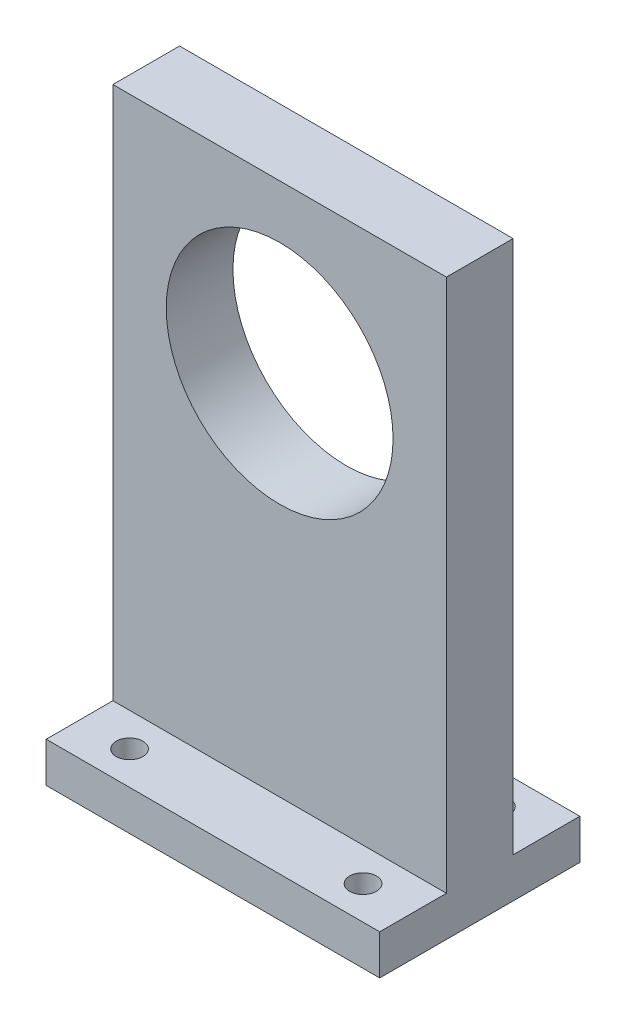
ISO-10303-21;
HEADER;
FILE_DESCRIPTION(('STEP AP214'),'2;1');
FILE_NAME('part.step','',(''),(''),'','','');
FILE_SCHEMA(('AUTOMOTIVE_DESIGN { 1 0 10303 214 1 1 1 1 }'));
ENDSEC;
DATA;
#1=APPLICATION_CONTEXT('core data for automotive mechanical design processes');
#2=APPLICATION_PROTOCOL_DEFINITION('international standard','automotive_design',2000,#1);
#3=PRODUCT_CONTEXT('',#1,'mechanical');
#4=PRODUCT('Part','Part','',(#3));
#5=PRODUCT_RELATED_PRODUCT_CATEGORY('part','',(#4));
#6=PRODUCT_DEFINITION_FORMATION('','',#4);
#7=PRODUCT_DEFINITION_CONTEXT('part definition',#1,'design');
#8=PRODUCT_DEFINITION('design','',#6,#7);
#9=PRODUCT_DEFINITION_SHAPE('','',#8);
#10=(LENGTH_UNIT() NAMED_UNIT(*) SI_UNIT(.MILLI.,.METRE.));
#11=(NAMED_UNIT(*) PLANE_ANGLE_UNIT() SI_UNIT($,.RADIAN.));
#12=(NAMED_UNIT(*) SI_UNIT($,.STERADIAN.) SOLID_ANGLE_UNIT());
#13=UNCERTAINTY_MEASURE_WITH_UNIT(LENGTH_MEASURE(1.E-05),#10,'distance_accuracy_value','');
#14=(GEOMETRIC_REPRESENTATION_CONTEXT(3) GLOBAL_UNCERTAINTY_ASSIGNED_CONTEXT((#13)) GLOBAL_UNIT_ASSIGNED_CONTEXT((#10,
#11,#12)) REPRESENTATION_CONTEXT('',''));
#15=CARTESIAN_POINT('',(0.,0.,0.));
#16=DIRECTION('',(0.,0.,1.));
#17=DIRECTION('',(1.,0.,0.));
#18=AXIS2_PLACEMENT_3D('',#15,#16,#17);
#19=CARTESIAN_POINT('',(0.,3.,0.));
#20=DIRECTION('',(0.,-1.,0.));
#21=DIRECTION('',(0.,0.,-1.));
#22=AXIS2_PLACEMENT_3D('',#19,#20,#21);
#23=PLANE('',#22);
#24=CARTESIAN_POINT('',(-8.75000000000001,3.,5.));
#25=DIRECTION('',(0.,-1.,0.));
#26=DIRECTION('',(0.,0.,-1.));
#27=AXIS2_PLACEMENT_3D('',#24,#25,#26);
#28=CIRCLE('',#27,1.);
#29=CARTESIAN_POINT('',(-8.75000000000001,3.,4.));
#30=VERTEX_POINT('',#29);
#31=EDGE_CURVE('E198',#30,#30,#28,.T.);
#32=ORIENTED_EDGE('',*,*,#31,.T.);
#33=EDGE_LOOP('',(#32));
#34=FACE_BOUND('',#33,.T.);
#35=CARTESIAN_POINT('',(8.75,3.,5.));
#36=DIRECTION('',(0.,-1.,0.));
#37=DIRECTION('',(0.,0.,-1.));
#38=AXIS2_PLACEMENT_3D('',#35,#36,#37);
#39=CIRCLE('',#38,1.);
#40=CARTESIAN_POINT('',(8.75,3.,4.));
#41=VERTEX_POINT('',#40);
#42=EDGE_CURVE('E191',#41,#41,#39,.T.);
#43=ORIENTED_EDGE('',*,*,#42,.T.);
#44=EDGE_LOOP('',(#43));
#45=FACE_BOUND('',#44,.T.);
#46=DIRECTION('',(1.,0.,0.));
#47=VECTOR('',#46,1.);
#48=CARTESIAN_POINT('',(-12.5,3.,2.5));
#49=LINE('',#48,#47);
#50=CARTESIAN_POINT('',(-12.5,3.,2.5));
#51=VERTEX_POINT('',#50);
#52=CARTESIAN_POINT('',(12.5,3.,2.5));
#53=VERTEX_POINT('',#52);
#54=EDGE_CURVE('E49',#51,#53,#49,.T.);
#55=ORIENTED_EDGE('',*,*,#54,.F.);
#56=DIRECTION('',(0.,0.,1.));
#57=VECTOR('',#56,1.);
#58=CARTESIAN_POINT('',(-12.5,3.,7.5));
#59=LINE('',#58,#57);
#60=CARTESIAN_POINT('',(-12.5,3.,7.5));
#61=VERTEX_POINT('',#60);
#62=EDGE_CURVE('E134',#51,#61,#59,.T.);
#63=ORIENTED_EDGE('',*,*,#62,.T.);
#64=DIRECTION('',(1.,0.,0.));
#65=VECTOR('',#64,1.);
#66=CARTESIAN_POINT('',(-12.5,3.,7.5));
#67=LINE('',#66,#65);
#68=CARTESIAN_POINT('',(12.5,3.,7.5));
#69=VERTEX_POINT('',#68);
#70=EDGE_CURVE('E137',#61,#69,#67,.T.);
#71=ORIENTED_EDGE('',*,*,#70,.T.);
#72=DIRECTION('',(0.,0.,-1.));
#73=VECTOR('',#72,1.);
#74=CARTESIAN_POINT('',(12.5,3.,7.5));
#75=LINE('',#74,#73);
#76=EDGE_CURVE('E130',#69,#53,#75,.T.);
#77=ORIENTED_EDGE('',*,*,#76,.T.);
#78=EDGE_LOOP('',(#55,#63,#71,#77));
#79=FACE_BOUND('',#78,.T.);
#80=ADVANCED_FACE('F34',(#34,#45,#79),#23,.F.);
#81=CARTESIAN_POINT('',(-8.75000000000001,3.,-5.));
#82=DIRECTION('',(0.,1.,0.));
#83=DIRECTION('',(0.,0.,1.));
#84=AXIS2_PLACEMENT_3D('',#81,#82,#83);
#85=CIRCLE('',#84,1.);
#86=CARTESIAN_POINT('',(-8.75000000000001,3.,-4.));
#87=VERTEX_POINT('',#86);
#88=EDGE_CURVE('E186',#87,#87,#85,.T.);
#89=ORIENTED_EDGE('',*,*,#88,.F.);
#90=EDGE_LOOP('',(#89));
#91=FACE_BOUND('',#90,.T.);
#92=CARTESIAN_POINT('',(8.75,3.,-5.));
#93=DIRECTION('',(0.,1.,0.));
#94=DIRECTION('',(0.,0.,1.));
#95=AXIS2_PLACEMENT_3D('',#92,#93,#94);
#96=CIRCLE('',#95,1.);
#97=CARTESIAN_POINT('',(8.75,3.,-4.));
#98=VERTEX_POINT('',#97);
#99=EDGE_CURVE('E179',#98,#98,#96,.T.);
#100=ORIENTED_EDGE('',*,*,#99,.F.);
#101=EDGE_LOOP('',(#100));
#102=FACE_BOUND('',#101,.T.);
#103=DIRECTION('',(-1.,0.,0.));
#104=VECTOR('',#103,1.);
#105=CARTESIAN_POINT('',(-12.5,3.,-2.5));
#106=LINE('',#105,#104);
#107=CARTESIAN_POINT('',(12.5,3.,-2.5));
#108=VERTEX_POINT('',#107);
#109=CARTESIAN_POINT('',(-12.5,3.,-2.5));
#110=VERTEX_POINT('',#109);
#111=EDGE_CURVE('E57',#108,#110,#106,.T.);
#112=ORIENTED_EDGE('',*,*,#111,.F.);
#113=CARTESIAN_POINT('',(12.5,3.,-7.5));
#114=VERTEX_POINT('',#113);
#115=EDGE_CURVE('E121',#108,#114,#75,.T.);
#116=ORIENTED_EDGE('',*,*,#115,.T.);
#117=DIRECTION('',(-1.,0.,0.));
#118=VECTOR('',#117,1.);
#119=CARTESIAN_POINT('',(-12.5,3.,-7.5));
#120=LINE('',#119,#118);
#121=CARTESIAN_POINT('',(-12.5,3.,-7.5));
#122=VERTEX_POINT('',#121);
#123=EDGE_CURVE('E132',#114,#122,#120,.T.);
#124=ORIENTED_EDGE('',*,*,#123,.T.);
#125=EDGE_CURVE('E135',#122,#110,#59,.T.);
#126=ORIENTED_EDGE('',*,*,#125,.T.);
#127=EDGE_LOOP('',(#112,#116,#124,#126));
#128=FACE_BOUND('',#127,.T.);
#129=ADVANCED_FACE('F223',(#91,#102,#128),#23,.F.);
#130=CARTESIAN_POINT('',(12.5,3.,7.5));
#131=DIRECTION('',(-1.,0.,0.));
#132=DIRECTION('',(0.,0.,1.));
#133=AXIS2_PLACEMENT_3D('',#130,#131,#132);
#134=PLANE('',#133);
#135=DIRECTION('',(0.,0.,-1.));
#136=VECTOR('',#135,1.);
#137=CARTESIAN_POINT('',(12.5,0.,7.5));
#138=LINE('',#137,#136);
#139=CARTESIAN_POINT('',(12.5,0.,7.5));
#140=VERTEX_POINT('',#139);
#141=CARTESIAN_POINT('',(12.5,0.,-7.5));
#142=VERTEX_POINT('',#141);
#143=EDGE_CURVE('E122',#140,#142,#138,.T.);
#144=ORIENTED_EDGE('',*,*,#143,.T.);
#145=DIRECTION('',(0.,-1.,0.));
#146=VECTOR('',#145,1.);
#147=CARTESIAN_POINT('',(12.5,3.,-7.5));
#148=LINE('',#147,#146);
#149=EDGE_CURVE('E11',#114,#142,#148,.T.);
#150=ORIENTED_EDGE('',*,*,#149,.F.);
#151=ORIENTED_EDGE('',*,*,#115,.F.);
#152=DIRECTION('',(0.,-1.,0.));
#153=VECTOR('',#152,1.);
#154=CARTESIAN_POINT('',(12.5,43.,-2.5));
#155=LINE('',#154,#153);
#156=CARTESIAN_POINT('',(12.5,43.,-2.5));
#157=VERTEX_POINT('',#156);
#158=EDGE_CURVE('E103',#157,#108,#155,.T.);
#159=ORIENTED_EDGE('',*,*,#158,.F.);
#160=DIRECTION('',(0.,0.,-1.));
#161=VECTOR('',#160,1.);
#162=CARTESIAN_POINT('',(12.5,43.,2.5));
#163=LINE('',#162,#161);
#164=CARTESIAN_POINT('',(12.5,43.,2.5));
#165=VERTEX_POINT('',#164);
#166=EDGE_CURVE('E109',#165,#157,#163,.T.);
#167=ORIENTED_EDGE('',*,*,#166,.F.);
#168=DIRECTION('',(0.,-1.,0.));
#169=VECTOR('',#168,1.);
#170=CARTESIAN_POINT('',(12.5,43.,2.5));
#171=LINE('',#170,#169);
#172=EDGE_CURVE('E167',#165,#53,#171,.T.);
#173=ORIENTED_EDGE('',*,*,#172,.T.);
#174=ORIENTED_EDGE('',*,*,#76,.F.);
#175=DIRECTION('',(0.,-1.,0.));
#176=VECTOR('',#175,1.);
#177=CARTESIAN_POINT('',(12.5,3.,7.5));
#178=LINE('',#177,#176);
#179=EDGE_CURVE('E138',#69,#140,#178,.T.);
#180=ORIENTED_EDGE('',*,*,#179,.T.);
#181=EDGE_LOOP('',(#144,#150,#151,#159,#167,#173,#174,#180));
#182=FACE_BOUND('',#181,.T.);
#183=ADVANCED_FACE('F36',(#182),#134,.F.);
#184=CARTESIAN_POINT('',(-12.5,3.,-7.5));
#185=DIRECTION('',(0.,0.,1.));
#186=DIRECTION('',(1.,0.,0.));
#187=AXIS2_PLACEMENT_3D('',#184,#185,#186);
#188=PLANE('',#187);
#189=DIRECTION('',(-1.,0.,0.));
#190=VECTOR('',#189,1.);
#191=CARTESIAN_POINT('',(-12.5,0.,-7.5));
#192=LINE('',#191,#190);
#193=CARTESIAN_POINT('',(-12.5,0.,-7.5));
#194=VERTEX_POINT('',#193);
#195=EDGE_CURVE('E124',#142,#194,#192,.T.);
#196=ORIENTED_EDGE('',*,*,#195,.T.);
#197=DIRECTION('',(0.,-1.,0.));
#198=VECTOR('',#197,1.);
#199=CARTESIAN_POINT('',(-12.5,3.,-7.5));
#200=LINE('',#199,#198);
#201=EDGE_CURVE('E42',#122,#194,#200,.T.);
#202=ORIENTED_EDGE('',*,*,#201,.F.);
#203=ORIENTED_EDGE('',*,*,#123,.F.);
#204=ORIENTED_EDGE('',*,*,#149,.T.);
#205=EDGE_LOOP('',(#196,#202,#203,#204));
#206=FACE_BOUND('',#205,.T.);
#207=ADVANCED_FACE('F238',(#206),#188,.F.);
#208=CARTESIAN_POINT('',(-12.5,3.,7.5));
#209=DIRECTION('',(1.,0.,0.));
#210=DIRECTION('',(0.,0.,-1.));
#211=AXIS2_PLACEMENT_3D('',#208,#209,#210);
#212=PLANE('',#211);
#213=DIRECTION('',(0.,0.,1.));
#214=VECTOR('',#213,1.);
#215=CARTESIAN_POINT('',(-12.5,0.,7.5));
#216=LINE('',#215,#214);
#217=CARTESIAN_POINT('',(-12.5,0.,7.5));
#218=VERTEX_POINT('',#217);
#219=EDGE_CURVE('E141',#194,#218,#216,.T.);
#220=ORIENTED_EDGE('',*,*,#219,.T.);
#221=DIRECTION('',(0.,-1.,0.));
#222=VECTOR('',#221,1.);
#223=CARTESIAN_POINT('',(-12.5,3.,7.5));
#224=LINE('',#223,#222);
#225=EDGE_CURVE('E147',#61,#218,#224,.T.);
#226=ORIENTED_EDGE('',*,*,#225,.F.);
#227=ORIENTED_EDGE('',*,*,#62,.F.);
#228=DIRECTION('',(0.,-1.,0.));
#229=VECTOR('',#228,1.);
#230=CARTESIAN_POINT('',(-12.5,43.,2.5));
#231=LINE('',#230,#229);
#232=CARTESIAN_POINT('',(-12.5,43.,2.5));
#233=VERTEX_POINT('',#232);
#234=EDGE_CURVE('E126',#233,#51,#231,.T.);
#235=ORIENTED_EDGE('',*,*,#234,.F.);
#236=DIRECTION('',(0.,0.,1.));
#237=VECTOR('',#236,1.);
#238=CARTESIAN_POINT('',(-12.5,43.,2.5));
#239=LINE('',#238,#237);
#240=CARTESIAN_POINT('',(-12.5,43.,-2.5));
#241=VERTEX_POINT('',#240);
#242=EDGE_CURVE('E108',#241,#233,#239,.T.);
#243=ORIENTED_EDGE('',*,*,#242,.F.);
#244=DIRECTION('',(0.,-1.,0.));
#245=VECTOR('',#244,1.);
#246=CARTESIAN_POINT('',(-12.5,43.,-2.5));
#247=LINE('',#246,#245);
#248=EDGE_CURVE('E105',#241,#110,#247,.T.);
#249=ORIENTED_EDGE('',*,*,#248,.T.);
#250=ORIENTED_EDGE('',*,*,#125,.F.);
#251=ORIENTED_EDGE('',*,*,#201,.T.);
#252=EDGE_LOOP('',(#220,#226,#227,#235,#243,#249,#250,#251));
#253=FACE_BOUND('',#252,.T.);
#254=ADVANCED_FACE('F154',(#253),#212,.F.);
#255=CARTESIAN_POINT('',(-12.5,3.,7.5));
#256=DIRECTION('',(0.,0.,-1.));
#257=DIRECTION('',(-1.,0.,0.));
#258=AXIS2_PLACEMENT_3D('',#255,#256,#257);
#259=PLANE('',#258);
#260=DIRECTION('',(1.,0.,0.));
#261=VECTOR('',#260,1.);
#262=CARTESIAN_POINT('',(-12.5,0.,7.5));
#263=LINE('',#262,#261);
#264=EDGE_CURVE('E143',#218,#140,#263,.T.);
#265=ORIENTED_EDGE('',*,*,#264,.T.);
#266=ORIENTED_EDGE('',*,*,#179,.F.);
#267=ORIENTED_EDGE('',*,*,#70,.F.);
#268=ORIENTED_EDGE('',*,*,#225,.T.);
#269=EDGE_LOOP('',(#265,#266,#267,#268));
#270=FACE_BOUND('',#269,.T.);
#271=ADVANCED_FACE('F164',(#270),#259,.F.);
#272=CARTESIAN_POINT('',(0.,0.,0.));
#273=DIRECTION('',(0.,-1.,0.));
#274=DIRECTION('',(0.,0.,-1.));
#275=AXIS2_PLACEMENT_3D('',#272,#273,#274);
#276=PLANE('',#275);
#277=CARTESIAN_POINT('',(-8.75000000000001,0.,5.));
#278=DIRECTION('',(0.,-1.,0.));
#279=DIRECTION('',(0.,0.,-1.));
#280=AXIS2_PLACEMENT_3D('',#277,#278,#279);
#281=CIRCLE('',#280,1.);
#282=CARTESIAN_POINT('',(-8.75000000000001,0.,4.));
#283=VERTEX_POINT('',#282);
#284=EDGE_CURVE('E183',#283,#283,#281,.T.);
#285=ORIENTED_EDGE('',*,*,#284,.F.);
#286=EDGE_LOOP('',(#285));
#287=FACE_BOUND('',#286,.T.);
#288=CARTESIAN_POINT('',(8.75,0.,5.));
#289=DIRECTION('',(0.,-1.,0.));
#290=DIRECTION('',(0.,0.,-1.));
#291=AXIS2_PLACEMENT_3D('',#288,#289,#290);
#292=CIRCLE('',#291,1.);
#293=CARTESIAN_POINT('',(8.75,0.,4.));
#294=VERTEX_POINT('',#293);
#295=EDGE_CURVE('E194',#294,#294,#292,.T.);
#296=ORIENTED_EDGE('',*,*,#295,.F.);
#297=EDGE_LOOP('',(#296));
#298=FACE_BOUND('',#297,.T.);
#299=CARTESIAN_POINT('',(-8.75000000000001,0.,-5.));
#300=DIRECTION('',(0.,1.,0.));
#301=DIRECTION('',(0.,0.,1.));
#302=AXIS2_PLACEMENT_3D('',#299,#300,#301);
#303=CIRCLE('',#302,1.);
#304=CARTESIAN_POINT('',(-8.75000000000001,0.,-4.));
#305=VERTEX_POINT('',#304);
#306=EDGE_CURVE('E173',#305,#305,#303,.T.);
#307=ORIENTED_EDGE('',*,*,#306,.T.);
#308=EDGE_LOOP('',(#307));
#309=FACE_BOUND('',#308,.T.);
#310=CARTESIAN_POINT('',(8.75,0.,-5.));
#311=DIRECTION('',(0.,1.,0.));
#312=DIRECTION('',(0.,0.,1.));
#313=AXIS2_PLACEMENT_3D('',#310,#311,#312);
#314=CIRCLE('',#313,1.);
#315=CARTESIAN_POINT('',(8.75,0.,-4.));
#316=VERTEX_POINT('',#315);
#317=EDGE_CURVE('E182',#316,#316,#314,.T.);
#318=ORIENTED_EDGE('',*,*,#317,.T.);
#319=EDGE_LOOP('',(#318));
#320=FACE_BOUND('',#319,.T.);
#321=ORIENTED_EDGE('',*,*,#143,.F.);
#322=ORIENTED_EDGE('',*,*,#264,.F.);
#323=ORIENTED_EDGE('',*,*,#219,.F.);
#324=ORIENTED_EDGE('',*,*,#195,.F.);
#325=EDGE_LOOP('',(#321,#322,#323,#324));
#326=FACE_BOUND('',#325,.T.);
#327=ADVANCED_FACE('F161',(#287,#298,#309,#320,#326),#276,.T.);
#328=CARTESIAN_POINT('',(-12.5,43.,-2.5));
#329=DIRECTION('',(0.,0.,1.));
#330=DIRECTION('',(1.,0.,0.));
#331=AXIS2_PLACEMENT_3D('',#328,#329,#330);
#332=PLANE('',#331);
#333=CARTESIAN_POINT('',(0.,30.5,-2.5));
#334=DIRECTION('',(0.,0.,1.));
#335=DIRECTION('',(1.,0.,0.));
#336=AXIS2_PLACEMENT_3D('',#333,#334,#335);
#337=CIRCLE('',#336,8.5);
#338=CARTESIAN_POINT('',(8.49999999999999,30.5,-2.5));
#339=VERTEX_POINT('',#338);
#340=EDGE_CURVE('E195',#339,#339,#337,.T.);
#341=ORIENTED_EDGE('',*,*,#340,.T.);
#342=EDGE_LOOP('',(#341));
#343=FACE_BOUND('',#342,.T.);
#344=ORIENTED_EDGE('',*,*,#111,.T.);
#345=ORIENTED_EDGE('',*,*,#248,.F.);
#346=DIRECTION('',(-1.,0.,0.));
#347=VECTOR('',#346,1.);
#348=CARTESIAN_POINT('',(-12.5,43.,-2.5));
#349=LINE('',#348,#347);
#350=EDGE_CURVE('E99',#157,#241,#349,.T.);
#351=ORIENTED_EDGE('',*,*,#350,.F.);
#352=ORIENTED_EDGE('',*,*,#158,.T.);
#353=EDGE_LOOP('',(#344,#345,#351,#352));
#354=FACE_BOUND('',#353,.T.);
#355=ADVANCED_FACE('F101',(#343,#354),#332,.F.);
#356=CARTESIAN_POINT('',(-12.5,43.,2.5));
#357=DIRECTION('',(0.,0.,-1.));
#358=DIRECTION('',(-1.,0.,0.));
#359=AXIS2_PLACEMENT_3D('',#356,#357,#358);
#360=PLANE('',#359);
#361=CARTESIAN_POINT('',(0.,30.5,2.5));
#362=DIRECTION('',(0.,0.,1.));
#363=DIRECTION('',(1.,0.,0.));
#364=AXIS2_PLACEMENT_3D('',#361,#362,#363);
#365=CIRCLE('',#364,8.5);
#366=CARTESIAN_POINT('',(8.49999999999999,30.5,2.5));
#367=VERTEX_POINT('',#366);
#368=EDGE_CURVE('E205',#367,#367,#365,.T.);
#369=ORIENTED_EDGE('',*,*,#368,.F.);
#370=EDGE_LOOP('',(#369));
#371=FACE_BOUND('',#370,.T.);
#372=ORIENTED_EDGE('',*,*,#54,.T.);
#373=ORIENTED_EDGE('',*,*,#172,.F.);
#374=DIRECTION('',(1.,0.,0.));
#375=VECTOR('',#374,1.);
#376=CARTESIAN_POINT('',(-12.5,43.,2.5));
#377=LINE('',#376,#375);
#378=EDGE_CURVE('E114',#233,#165,#377,.T.);
#379=ORIENTED_EDGE('',*,*,#378,.F.);
#380=ORIENTED_EDGE('',*,*,#234,.T.);
#381=EDGE_LOOP('',(#372,#373,#379,#380));
#382=FACE_BOUND('',#381,.T.);
#383=ADVANCED_FACE('F170',(#371,#382),#360,.F.);
#384=CARTESIAN_POINT('',(0.,43.,0.));
#385=DIRECTION('',(0.,-1.,0.));
#386=DIRECTION('',(0.,0.,-1.));
#387=AXIS2_PLACEMENT_3D('',#384,#385,#386);
#388=PLANE('',#387);
#389=ORIENTED_EDGE('',*,*,#166,.T.);
#390=ORIENTED_EDGE('',*,*,#350,.T.);
#391=ORIENTED_EDGE('',*,*,#242,.T.);
#392=ORIENTED_EDGE('',*,*,#378,.T.);
#393=EDGE_LOOP('',(#389,#390,#391,#392));
#394=FACE_BOUND('',#393,.T.);
#395=ADVANCED_FACE('F112',(#394),#388,.F.);
#396=CARTESIAN_POINT('',(8.75,0.,-5.));
#397=DIRECTION('',(0.,1.,0.));
#398=DIRECTION('',(0.,0.,1.));
#399=AXIS2_PLACEMENT_3D('',#396,#397,#398);
#400=CYLINDRICAL_SURFACE('',#399,1.);
#401=ORIENTED_EDGE('',*,*,#317,.F.);
#402=EDGE_LOOP('',(#401));
#403=FACE_BOUND('',#402,.T.);
#404=ORIENTED_EDGE('',*,*,#99,.T.);
#405=EDGE_LOOP('',(#404));
#406=FACE_BOUND('',#405,.T.);
#407=ADVANCED_FACE('F218',(#403,#406),#400,.F.);
#408=CARTESIAN_POINT('',(-8.75000000000001,0.,-5.));
#409=DIRECTION('',(0.,1.,0.));
#410=DIRECTION('',(0.,0.,1.));
#411=AXIS2_PLACEMENT_3D('',#408,#409,#410);
#412=CYLINDRICAL_SURFACE('',#411,1.);
#413=ORIENTED_EDGE('',*,*,#306,.F.);
#414=EDGE_LOOP('',(#413));
#415=FACE_BOUND('',#414,.T.);
#416=ORIENTED_EDGE('',*,*,#88,.T.);
#417=EDGE_LOOP('',(#416));
#418=FACE_BOUND('',#417,.T.);
#419=ADVANCED_FACE('F265',(#415,#418),#412,.F.);
#420=CARTESIAN_POINT('',(8.75,0.,5.));
#421=DIRECTION('',(0.,1.,0.));
#422=DIRECTION('',(0.,0.,1.));
#423=AXIS2_PLACEMENT_3D('',#420,#421,#422);
#424=CYLINDRICAL_SURFACE('',#423,1.);
#425=ORIENTED_EDGE('',*,*,#295,.T.);
#426=EDGE_LOOP('',(#425));
#427=FACE_BOUND('',#426,.T.);
#428=ORIENTED_EDGE('',*,*,#42,.F.);
#429=EDGE_LOOP('',(#428));
#430=FACE_BOUND('',#429,.T.);
#431=ADVANCED_FACE('F274',(#427,#430),#424,.F.);
#432=CARTESIAN_POINT('',(-8.75000000000001,0.,5.));
#433=DIRECTION('',(0.,1.,0.));
#434=DIRECTION('',(0.,0.,1.));
#435=AXIS2_PLACEMENT_3D('',#432,#433,#434);
#436=CYLINDRICAL_SURFACE('',#435,1.);
#437=ORIENTED_EDGE('',*,*,#284,.T.);
#438=EDGE_LOOP('',(#437));
#439=FACE_BOUND('',#438,.T.);
#440=ORIENTED_EDGE('',*,*,#31,.F.);
#441=EDGE_LOOP('',(#440));
#442=FACE_BOUND('',#441,.T.);
#443=ADVANCED_FACE('F294',(#439,#442),#436,.F.);
#444=CARTESIAN_POINT('',(0.,30.5,-7.5));
#445=DIRECTION('',(0.,0.,1.));
#446=DIRECTION('',(1.,0.,0.));
#447=AXIS2_PLACEMENT_3D('',#444,#445,#446);
#448=CYLINDRICAL_SURFACE('',#447,8.5);
#449=ORIENTED_EDGE('',*,*,#368,.T.);
#450=EDGE_LOOP('',(#449));
#451=FACE_BOUND('',#450,.T.);
#452=ORIENTED_EDGE('',*,*,#340,.F.);
#453=EDGE_LOOP('',(#452));
#454=FACE_BOUND('',#453,.T.);
#455=ADVANCED_FACE('F209',(#451,#454),#448,.F.);
#456=CLOSED_SHELL('',(#80,#129,#183,#207,#254,#271,#327,#355,#383,#395,#407,#419,#431,#443,#455));
#457=MANIFOLD_SOLID_BREP('B2',#456);
#458=ADVANCED_BREP_SHAPE_REPRESENTATION('',(#18,#457),#14);
#459=SHAPE_DEFINITION_REPRESENTATION(#9,#458);
ENDSEC;
END-ISO-10303-21;
